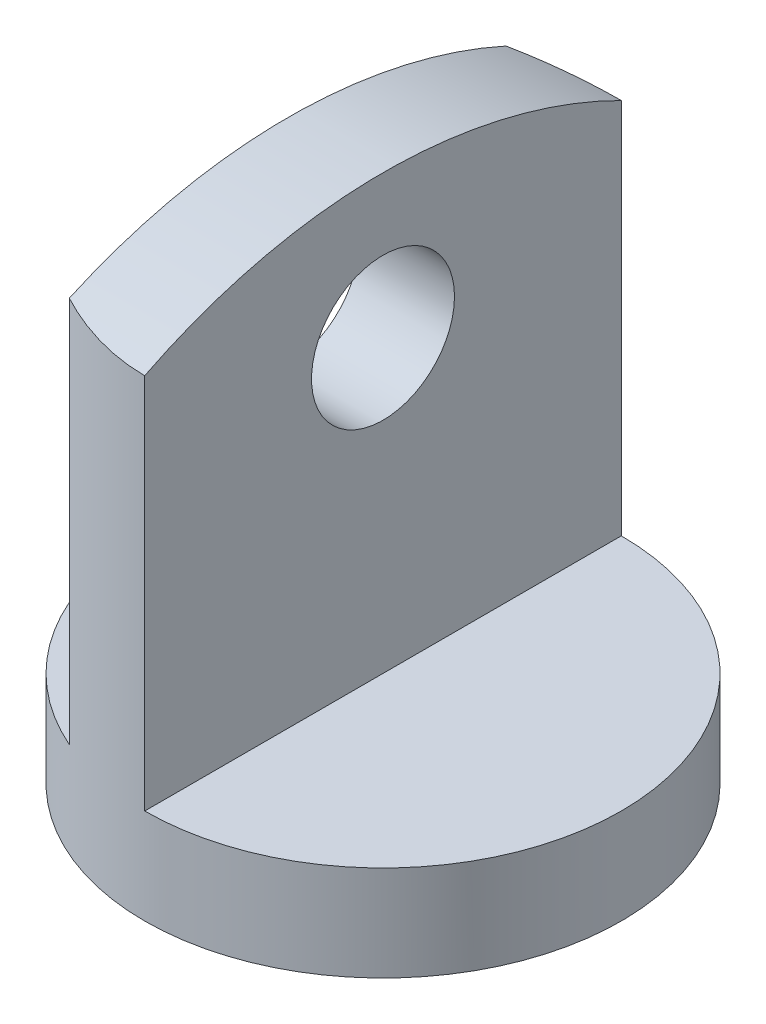
ISO-10303-21;
HEADER;
FILE_DESCRIPTION(('STEP AP214'),'2;1');
FILE_NAME('part.step','',(''),(''),'','','');
FILE_SCHEMA(('AUTOMOTIVE_DESIGN { 1 0 10303 214 1 1 1 1 }'));
ENDSEC;
DATA;
#1=APPLICATION_CONTEXT('core data for automotive mechanical design processes');
#2=APPLICATION_PROTOCOL_DEFINITION('international standard','automotive_design',2000,#1);
#3=PRODUCT_CONTEXT('',#1,'mechanical');
#4=PRODUCT('Part','Part','',(#3));
#5=PRODUCT_RELATED_PRODUCT_CATEGORY('part','',(#4));
#6=PRODUCT_DEFINITION_FORMATION('','',#4);
#7=PRODUCT_DEFINITION_CONTEXT('part definition',#1,'design');
#8=PRODUCT_DEFINITION('design','',#6,#7);
#9=PRODUCT_DEFINITION_SHAPE('','',#8);
#10=(LENGTH_UNIT() NAMED_UNIT(*) SI_UNIT(.MILLI.,.METRE.));
#11=(NAMED_UNIT(*) PLANE_ANGLE_UNIT() SI_UNIT($,.RADIAN.));
#12=(NAMED_UNIT(*) SI_UNIT($,.STERADIAN.) SOLID_ANGLE_UNIT());
#13=UNCERTAINTY_MEASURE_WITH_UNIT(LENGTH_MEASURE(1.E-05),#10,'distance_accuracy_value','');
#14=(GEOMETRIC_REPRESENTATION_CONTEXT(3) GLOBAL_UNCERTAINTY_ASSIGNED_CONTEXT((#13)) GLOBAL_UNIT_ASSIGNED_CONTEXT((#10,
#11,#12)) REPRESENTATION_CONTEXT('',''));
#15=CARTESIAN_POINT('',(0.,0.,0.));
#16=DIRECTION('',(0.,0.,1.));
#17=DIRECTION('',(1.,0.,0.));
#18=AXIS2_PLACEMENT_3D('',#15,#16,#17);
#19=CARTESIAN_POINT('',(-99.9999999999999,555.,-229.128784747792));
#20=DIRECTION('',(1.,0.,0.));
#21=DIRECTION('',(0.,0.,-1.));
#22=AXIS2_PLACEMENT_3D('',#19,#20,#21);
#23=PLANE('',#22);
#24=CARTESIAN_POINT('',(-99.9999999999999,405.,0.));
#25=DIRECTION('',(1.,0.,0.));
#26=DIRECTION('',(0.,0.,-1.));
#27=AXIS2_PLACEMENT_3D('',#24,#25,#26);
#28=CIRCLE('',#27,75.);
#29=CARTESIAN_POINT('',(-99.9999999999999,405.,-75.));
#30=VERTEX_POINT('',#29);
#31=EDGE_CURVE('E158',#30,#30,#28,.F.);
#32=ORIENTED_EDGE('',*,*,#31,.F.);
#33=EDGE_LOOP('',(#32));
#34=FACE_BOUND('',#33,.T.);
#35=CARTESIAN_POINT('',(-99.9999999999999,0.,0.));
#36=DIRECTION('',(1.,0.,0.));
#37=DIRECTION('',(0.,0.,-1.));
#38=AXIS2_PLACEMENT_3D('',#35,#36,#37);
#39=CIRCLE('',#38,555.);
#40=CARTESIAN_POINT('',(-99.9999999999999,505.494807094989,-229.128784747792));
#41=VERTEX_POINT('',#40);
#42=CARTESIAN_POINT('',(-99.9999999999999,505.494807094989,229.128784747792));
#43=VERTEX_POINT('',#42);
#44=EDGE_CURVE('E94',#41,#43,#39,.T.);
#45=ORIENTED_EDGE('',*,*,#44,.F.);
#46=DIRECTION('',(0.,-1.,0.));
#47=VECTOR('',#46,1.);
#48=CARTESIAN_POINT('',(-99.9999999999999,555.,-229.128784747792));
#49=LINE('',#48,#47);
#50=CARTESIAN_POINT('',(-99.9999999999999,100.,-229.128784747792));
#51=VERTEX_POINT('',#50);
#52=EDGE_CURVE('E60',#41,#51,#49,.T.);
#53=ORIENTED_EDGE('',*,*,#52,.T.);
#54=DIRECTION('',(0.,0.,1.));
#55=VECTOR('',#54,1.);
#56=CARTESIAN_POINT('',(-99.9999999999999,100.,-229.128784747792));
#57=LINE('',#56,#55);
#58=CARTESIAN_POINT('',(-100.,100.,229.128784747792));
#59=VERTEX_POINT('',#58);
#60=EDGE_CURVE('E107',#51,#59,#57,.T.);
#61=ORIENTED_EDGE('',*,*,#60,.T.);
#62=DIRECTION('',(0.,-1.,0.));
#63=VECTOR('',#62,1.);
#64=CARTESIAN_POINT('',(-100.,555.,229.128784747792));
#65=LINE('',#64,#63);
#66=EDGE_CURVE('E105',#43,#59,#65,.T.);
#67=ORIENTED_EDGE('',*,*,#66,.F.);
#68=EDGE_LOOP('',(#45,#53,#61,#67));
#69=FACE_BOUND('',#68,.T.);
#70=ADVANCED_FACE('F39',(#34,#69),#23,.F.);
#71=CARTESIAN_POINT('',(0.,555.,-250.));
#72=DIRECTION('',(-1.,0.,0.));
#73=DIRECTION('',(0.,0.,1.));
#74=AXIS2_PLACEMENT_3D('',#71,#72,#73);
#75=PLANE('',#74);
#76=CARTESIAN_POINT('',(0.,405.,0.));
#77=DIRECTION('',(1.,0.,0.));
#78=DIRECTION('',(0.,0.,-1.));
#79=AXIS2_PLACEMENT_3D('',#76,#77,#78);
#80=CIRCLE('',#79,75.);
#81=CARTESIAN_POINT('',(0.,405.,-75.));
#82=VERTEX_POINT('',#81);
#83=EDGE_CURVE('E172',#82,#82,#80,.T.);
#84=ORIENTED_EDGE('',*,*,#83,.F.);
#85=EDGE_LOOP('',(#84));
#86=FACE_BOUND('',#85,.T.);
#87=DIRECTION('',(0.,-1.,0.));
#88=VECTOR('',#87,1.);
#89=CARTESIAN_POINT('',(0.,555.,-250.));
#90=LINE('',#89,#88);
#91=CARTESIAN_POINT('',(0.,495.504793115062,-250.));
#92=VERTEX_POINT('',#91);
#93=CARTESIAN_POINT('',(0.,100.,-250.));
#94=VERTEX_POINT('',#93);
#95=EDGE_CURVE('E67',#92,#94,#90,.T.);
#96=ORIENTED_EDGE('',*,*,#95,.F.);
#97=CARTESIAN_POINT('',(0.,0.,0.));
#98=DIRECTION('',(1.,0.,0.));
#99=DIRECTION('',(0.,0.,-1.));
#100=AXIS2_PLACEMENT_3D('',#97,#98,#99);
#101=CIRCLE('',#100,555.);
#102=CARTESIAN_POINT('',(0.,495.504793115062,250.));
#103=VERTEX_POINT('',#102);
#104=EDGE_CURVE('E88',#103,#92,#101,.F.);
#105=ORIENTED_EDGE('',*,*,#104,.F.);
#106=DIRECTION('',(0.,-1.,0.));
#107=VECTOR('',#106,1.);
#108=CARTESIAN_POINT('',(0.,555.,250.));
#109=LINE('',#108,#107);
#110=CARTESIAN_POINT('',(0.,100.,250.));
#111=VERTEX_POINT('',#110);
#112=EDGE_CURVE('E103',#103,#111,#109,.T.);
#113=ORIENTED_EDGE('',*,*,#112,.T.);
#114=DIRECTION('',(0.,0.,-1.));
#115=VECTOR('',#114,1.);
#116=CARTESIAN_POINT('',(0.,100.,-250.));
#117=LINE('',#116,#115);
#118=EDGE_CURVE('E102',#111,#94,#117,.T.);
#119=ORIENTED_EDGE('',*,*,#118,.T.);
#120=EDGE_LOOP('',(#96,#105,#113,#119));
#121=FACE_BOUND('',#120,.T.);
#122=ADVANCED_FACE('F100',(#86,#121),#75,.F.);
#123=CARTESIAN_POINT('',(250.,100.,0.));
#124=DIRECTION('',(0.,-1.,0.));
#125=DIRECTION('',(0.,0.,-1.));
#126=AXIS2_PLACEMENT_3D('',#123,#124,#125);
#127=PLANE('',#126);
#128=ORIENTED_EDGE('',*,*,#118,.F.);
#129=CARTESIAN_POINT('',(0.,100.,0.));
#130=DIRECTION('',(0.,1.,0.));
#131=DIRECTION('',(0.,0.,1.));
#132=AXIS2_PLACEMENT_3D('',#129,#130,#131);
#133=CIRCLE('',#132,250.);
#134=EDGE_CURVE('E114',#111,#94,#133,.T.);
#135=ORIENTED_EDGE('',*,*,#134,.T.);
#136=EDGE_LOOP('',(#128,#135));
#137=FACE_BOUND('',#136,.T.);
#138=ADVANCED_FACE('F134',(#137),#127,.F.);
#139=ORIENTED_EDGE('',*,*,#60,.F.);
#140=EDGE_CURVE('E113',#51,#59,#133,.T.);
#141=ORIENTED_EDGE('',*,*,#140,.T.);
#142=EDGE_LOOP('',(#139,#141));
#143=FACE_BOUND('',#142,.T.);
#144=ADVANCED_FACE('F127',(#143),#127,.F.);
#145=CARTESIAN_POINT('',(0.,50.,0.));
#146=DIRECTION('',(0.,1.,0.));
#147=DIRECTION('',(0.,0.,1.));
#148=AXIS2_PLACEMENT_3D('',#145,#146,#147);
#149=PLANE('',#148);
#150=CARTESIAN_POINT('',(0.,50.,0.));
#151=DIRECTION('',(0.,1.,0.));
#152=DIRECTION('',(0.,0.,1.));
#153=AXIS2_PLACEMENT_3D('',#150,#151,#152);
#154=CIRCLE('',#153,125.);
#155=CARTESIAN_POINT('',(0.,50.,125.));
#156=VERTEX_POINT('',#155);
#157=EDGE_CURVE('E53',#156,#156,#154,.T.);
#158=ORIENTED_EDGE('',*,*,#157,.F.);
#159=EDGE_LOOP('',(#158));
#160=FACE_BOUND('',#159,.T.);
#161=ADVANCED_FACE('F41',(#160),#149,.F.);
#162=CARTESIAN_POINT('',(0.,188.75,0.));
#163=DIRECTION('',(0.,1.,0.));
#164=DIRECTION('',(0.,0.,1.));
#165=AXIS2_PLACEMENT_3D('',#162,#163,#164);
#166=CYLINDRICAL_SURFACE('',#165,125.);
#167=CARTESIAN_POINT('',(0.,0.,0.));
#168=DIRECTION('',(0.,1.,0.));
#169=DIRECTION('',(0.,0.,1.));
#170=AXIS2_PLACEMENT_3D('',#167,#168,#169);
#171=CIRCLE('',#170,125.);
#172=CARTESIAN_POINT('',(0.,0.,125.));
#173=VERTEX_POINT('',#172);
#174=EDGE_CURVE('E119',#173,#173,#171,.T.);
#175=ORIENTED_EDGE('',*,*,#174,.F.);
#176=EDGE_LOOP('',(#175));
#177=FACE_BOUND('',#176,.T.);
#178=ORIENTED_EDGE('',*,*,#157,.T.);
#179=EDGE_LOOP('',(#178));
#180=FACE_BOUND('',#179,.T.);
#181=ADVANCED_FACE('F124',(#177,#180),#166,.F.);
#182=CARTESIAN_POINT('',(125.,0.,0.));
#183=DIRECTION('',(0.,1.,0.));
#184=DIRECTION('',(0.,0.,1.));
#185=AXIS2_PLACEMENT_3D('',#182,#183,#184);
#186=PLANE('',#185);
#187=CARTESIAN_POINT('',(0.,0.,0.));
#188=DIRECTION('',(0.,1.,0.));
#189=DIRECTION('',(0.,0.,1.));
#190=AXIS2_PLACEMENT_3D('',#187,#188,#189);
#191=CIRCLE('',#190,250.);
#192=CARTESIAN_POINT('',(0.,0.,250.));
#193=VERTEX_POINT('',#192);
#194=EDGE_CURVE('E116',#193,#193,#191,.T.);
#195=ORIENTED_EDGE('',*,*,#194,.F.);
#196=EDGE_LOOP('',(#195));
#197=FACE_BOUND('',#196,.T.);
#198=ORIENTED_EDGE('',*,*,#174,.T.);
#199=EDGE_LOOP('',(#198));
#200=FACE_BOUND('',#199,.T.);
#201=ADVANCED_FACE('F132',(#197,#200),#186,.F.);
#202=CARTESIAN_POINT('',(0.,188.75,0.));
#203=DIRECTION('',(0.,1.,0.));
#204=DIRECTION('',(0.,0.,1.));
#205=AXIS2_PLACEMENT_3D('',#202,#203,#204);
#206=CYLINDRICAL_SURFACE('',#205,250.);
#207=ORIENTED_EDGE('',*,*,#52,.F.);
#208=CARTESIAN_POINT('',(-99.9999999999999,505.494807094989,-229.128784747792));
#209=CARTESIAN_POINT('',(-97.0379952961139,504.908803477879,-230.421545512133));
#210=CARTESIAN_POINT('',(-94.0475875438394,504.342278555909,-231.658254686004));
#211=CARTESIAN_POINT('',(-88.0139932198294,503.252093794604,-234.017148152981));
#212=CARTESIAN_POINT('',(-84.9708026520824,502.728437218007,-235.139323730463));
#213=CARTESIAN_POINT('',(-78.8332887632592,501.727525157508,-237.267513271674));
#214=CARTESIAN_POINT('',(-75.7389208123449,501.250312975918,-238.273418992367));
#215=CARTESIAN_POINT('',(-69.5065668519909,500.34653790115,-240.165446813072));
#216=CARTESIAN_POINT('',(-66.3685823458062,499.919973267203,-241.051573030081));
#217=CARTESIAN_POINT('',(-60.1135243790052,499.128433882257,-242.686249012105));
#218=CARTESIAN_POINT('',(-56.9971755053584,498.762447974123,-243.437081251974));
#219=CARTESIAN_POINT('',(-50.7322141017723,498.085394670475,-244.819386820784));
#220=CARTESIAN_POINT('',(-47.5836019420432,497.774326645543,-245.450861517699));
#221=CARTESIAN_POINT('',(-41.261523084766,497.20982209096,-246.592372114532));
#222=CARTESIAN_POINT('',(-38.0880745340415,496.956346928747,-247.102489430309));
#223=CARTESIAN_POINT('',(-31.7200784288129,496.508890620896,-248.000350170061));
#224=CARTESIAN_POINT('',(-28.5255337255292,496.314901597052,-248.388109799001));
#225=CARTESIAN_POINT('',(-23.2284360034769,496.044535515337,-248.927448574436));
#226=CARTESIAN_POINT('',(-21.1302864704716,495.950685257343,-249.114331032274));
#227=CARTESIAN_POINT('',(-16.9292124032631,495.78946491035,-249.435039186636));
#228=CARTESIAN_POINT('',(-14.8262886550585,495.722090741295,-249.568873058155));
#229=CARTESIAN_POINT('',(-10.6038485626309,495.61372103911,-249.784016481792));
#230=CARTESIAN_POINT('',(-8.48431088300697,495.572893627013,-249.864991289108));
#231=CARTESIAN_POINT('',(-4.24318431808832,495.518418580272,-249.972993328419));
#232=CARTESIAN_POINT('',(-2.12159516592735,495.504775156574,-250.000012202351));
#233=CARTESIAN_POINT('',(0.,495.504793115062,-250.));
#234=B_SPLINE_CURVE_WITH_KNOTS('',3,(#208,#209,#210,#211,#212,#213,#214,#215,#216,#217,#218,
#219,#220,#221,#222,#223,#224,#225,#226,#227,#228,#229,#230,#231,#232,#233),.UNSPECIFIED.,.F.,
.F.,(4,2,2,2,2,2,2,2,2,2,2,2,4),(0.,9.85303204281786,19.706813310352,29.5696954396187,
39.4322384810282,49.1084919210532,58.7846344534267,68.4542670632221,78.1226184957293,
84.44749744671,90.771401329694,97.1349742813896,103.499532908021),.UNSPECIFIED.);
#235=EDGE_CURVE('E11',#41,#92,#234,.T.);
#236=ORIENTED_EDGE('',*,*,#235,.T.);
#237=ORIENTED_EDGE('',*,*,#95,.T.);
#238=ORIENTED_EDGE('',*,*,#134,.F.);
#239=ORIENTED_EDGE('',*,*,#112,.F.);
#240=CARTESIAN_POINT('',(0.,495.504793115062,250.));
#241=CARTESIAN_POINT('',(-1.64269887565896,495.504789423127,250.00000107385));
#242=CARTESIAN_POINT('',(-3.28534279505524,495.512962779518,249.983808387625));
#243=CARTESIAN_POINT('',(-6.56982718835366,495.545624981775,249.919057801996));
#244=CARTESIAN_POINT('',(-8.21166766382807,495.570113795584,249.870499966185));
#245=CARTESIAN_POINT('',(-13.1346987325091,495.667990499462,249.676322140561));
#246=CARTESIAN_POINT('',(-16.4136540114436,495.765788663581,249.482197825423));
#247=CARTESIAN_POINT('',(-22.958893366225,496.025619590587,248.965194095887));
#248=CARTESIAN_POINT('',(-26.2251767483485,496.187655821449,248.6423077301));
#249=CARTESIAN_POINT('',(-32.7388299333051,496.574528230866,247.868765576485));
#250=CARTESIAN_POINT('',(-35.9861999184034,496.799363803209,247.418111022025));
#251=CARTESIAN_POINT('',(-42.3973952966641,497.305250717603,246.399684838075));
#252=CARTESIAN_POINT('',(-45.5616682979017,497.585209614961,245.834183322302));
#253=CARTESIAN_POINT('',(-51.8608759373265,498.201490499707,244.582830936723));
#254=CARTESIAN_POINT('',(-54.9958097573878,498.537814053914,243.896976721339));
#255=CARTESIAN_POINT('',(-61.2297139559855,499.263956019295,242.407071831715));
#256=CARTESIAN_POINT('',(-64.3286992602001,499.653751299124,241.603072255351));
#257=CARTESIAN_POINT('',(-70.4869509758944,500.483869005386,239.878745108172));
#258=CARTESIAN_POINT('',(-73.5462218807416,500.924185659278,238.958430826184));
#259=CARTESIAN_POINT('',(-78.5699998633581,501.691527623925,237.341760437225));
#260=CARTESIAN_POINT('',(-80.5471591995765,502.005058948855,236.678047661726));
#261=CARTESIAN_POINT('',(-84.4810877123501,502.65126153039,235.302542745836));
#262=CARTESIAN_POINT('',(-86.4378609920795,502.983928843949,234.590760505119));
#263=CARTESIAN_POINT('',(-90.3420208951176,503.669500350483,233.11520858024));
#264=CARTESIAN_POINT('',(-92.2892789688351,504.022514867531,232.351150244696));
#265=CARTESIAN_POINT('',(-96.161634353186,504.745915809925,230.775455845364));
#266=CARTESIAN_POINT('',(-98.0867273788595,505.116305526289,229.963810760887));
#267=CARTESIAN_POINT('',(-99.9999999999999,505.494807094989,229.128784747792));
#268=B_SPLINE_CURVE_WITH_KNOTS('',3,(#240,#241,#242,#243,#244,#245,#246,#247,#248,#249,#250,
#251,#252,#253,#254,#255,#256,#257,#258,#259,#260,#261,#262,#263,#264,#265,#266,#267),
.UNSPECIFIED.,.F.,.F.,(4,2,2,2,2,2,2,2,2,2,2,2,2,4),(0.,4.9278868479406,9.85576401343531,
19.7107538890173,29.5662758712152,39.4217027196566,49.0985501992267,58.7756667193649,
68.4486101377123,78.120449430138,84.4468511578402,90.7719539435097,97.1353499033789,
103.499956052918),.UNSPECIFIED.);
#269=EDGE_CURVE('E91',#103,#43,#268,.T.);
#270=ORIENTED_EDGE('',*,*,#269,.T.);
#271=ORIENTED_EDGE('',*,*,#66,.T.);
#272=ORIENTED_EDGE('',*,*,#140,.F.);
#273=EDGE_LOOP('',(#207,#236,#237,#238,#239,#270,#271,#272));
#274=FACE_BOUND('',#273,.T.);
#275=ORIENTED_EDGE('',*,*,#194,.T.);
#276=EDGE_LOOP('',(#275));
#277=FACE_BOUND('',#276,.T.);
#278=ADVANCED_FACE('F96',(#274,#277),#206,.T.);
#279=CARTESIAN_POINT('',(-356.981866368586,0.,0.));
#280=DIRECTION('',(1.,0.,0.));
#281=DIRECTION('',(0.,0.,-1.));
#282=AXIS2_PLACEMENT_3D('',#279,#280,#281);
#283=CYLINDRICAL_SURFACE('',#282,555.);
#284=ORIENTED_EDGE('',*,*,#104,.T.);
#285=ORIENTED_EDGE('',*,*,#235,.F.);
#286=ORIENTED_EDGE('',*,*,#44,.T.);
#287=ORIENTED_EDGE('',*,*,#269,.F.);
#288=EDGE_LOOP('',(#284,#285,#286,#287));
#289=FACE_BOUND('',#288,.T.);
#290=ADVANCED_FACE('F89',(#289),#283,.T.);
#291=CARTESIAN_POINT('',(-356.981866368586,405.,0.));
#292=DIRECTION('',(1.,0.,0.));
#293=DIRECTION('',(0.,0.,-1.));
#294=AXIS2_PLACEMENT_3D('',#291,#292,#293);
#295=CYLINDRICAL_SURFACE('',#294,75.);
#296=ORIENTED_EDGE('',*,*,#31,.T.);
#297=EDGE_LOOP('',(#296));
#298=FACE_BOUND('',#297,.T.);
#299=ORIENTED_EDGE('',*,*,#83,.T.);
#300=EDGE_LOOP('',(#299));
#301=FACE_BOUND('',#300,.T.);
#302=ADVANCED_FACE('F162',(#298,#301),#295,.F.);
#303=CLOSED_SHELL('',(#70,#122,#138,#144,#161,#181,#201,#278,#290,#302));
#304=MANIFOLD_SOLID_BREP('B2',#303);
#305=ADVANCED_BREP_SHAPE_REPRESENTATION('',(#18,#304),#14);
#306=SHAPE_DEFINITION_REPRESENTATION(#9,#305);
ENDSEC;
END-ISO-10303-21;
